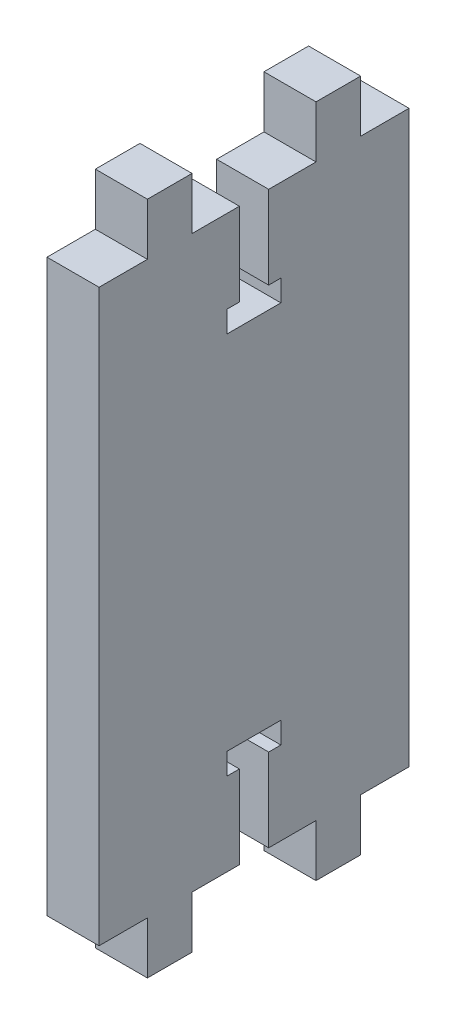
ISO-10303-21;
HEADER;
FILE_DESCRIPTION(('STEP AP214'),'2;1');
FILE_NAME('part.step','',(''),(''),'','','');
FILE_SCHEMA(('AUTOMOTIVE_DESIGN { 1 0 10303 214 1 1 1 1 }'));
ENDSEC;
DATA;
#1=APPLICATION_CONTEXT('core data for automotive mechanical design processes');
#2=APPLICATION_PROTOCOL_DEFINITION('international standard','automotive_design',2000,#1);
#3=PRODUCT_CONTEXT('',#1,'mechanical');
#4=PRODUCT('Part','Part','',(#3));
#5=PRODUCT_RELATED_PRODUCT_CATEGORY('part','',(#4));
#6=PRODUCT_DEFINITION_FORMATION('','',#4);
#7=PRODUCT_DEFINITION_CONTEXT('part definition',#1,'design');
#8=PRODUCT_DEFINITION('design','',#6,#7);
#9=PRODUCT_DEFINITION_SHAPE('','',#8);
#10=(LENGTH_UNIT() NAMED_UNIT(*) SI_UNIT(.MILLI.,.METRE.));
#11=(NAMED_UNIT(*) PLANE_ANGLE_UNIT() SI_UNIT($,.RADIAN.));
#12=(NAMED_UNIT(*) SI_UNIT($,.STERADIAN.) SOLID_ANGLE_UNIT());
#13=UNCERTAINTY_MEASURE_WITH_UNIT(LENGTH_MEASURE(1.E-05),#10,'distance_accuracy_value','');
#14=(GEOMETRIC_REPRESENTATION_CONTEXT(3) GLOBAL_UNCERTAINTY_ASSIGNED_CONTEXT((#13)) GLOBAL_UNIT_ASSIGNED_CONTEXT((#10,
#11,#12)) REPRESENTATION_CONTEXT('',''));
#15=CARTESIAN_POINT('',(0.,0.,0.));
#16=DIRECTION('',(0.,0.,1.));
#17=DIRECTION('',(1.,0.,0.));
#18=AXIS2_PLACEMENT_3D('',#15,#16,#17);
#19=CARTESIAN_POINT('',(5.334,-29.21,0.));
#20=DIRECTION('',(0.,1.,0.));
#21=DIRECTION('',(0.,0.,1.));
#22=AXIS2_PLACEMENT_3D('',#19,#20,#21);
#23=PLANE('',#22);
#24=DIRECTION('',(-1.,0.,0.));
#25=VECTOR('',#24,1.);
#26=CARTESIAN_POINT('',(5.334,-29.21,-6.34999999999999));
#27=LINE('',#26,#25);
#28=CARTESIAN_POINT('',(5.334,-29.21,-6.34999999999999));
#29=VERTEX_POINT('',#28);
#30=CARTESIAN_POINT('',(0.,-29.21,-6.34999999999999));
#31=VERTEX_POINT('',#30);
#32=EDGE_CURVE('E237',#29,#31,#27,.T.);
#33=ORIENTED_EDGE('',*,*,#32,.F.);
#34=DIRECTION('',(0.,0.,-1.));
#35=VECTOR('',#34,1.);
#36=CARTESIAN_POINT('',(5.334,-29.21,0.));
#37=LINE('',#36,#35);
#38=CARTESIAN_POINT('',(5.334,-29.21,-1.5));
#39=VERTEX_POINT('',#38);
#40=EDGE_CURVE('E584',#39,#29,#37,.T.);
#41=ORIENTED_EDGE('',*,*,#40,.F.);
#42=DIRECTION('',(-1.,0.,0.));
#43=VECTOR('',#42,1.);
#44=CARTESIAN_POINT('',(5.334,-29.21,-1.5));
#45=LINE('',#44,#43);
#46=CARTESIAN_POINT('',(0.,-29.21,-1.5));
#47=VERTEX_POINT('',#46);
#48=EDGE_CURVE('E337',#39,#47,#45,.T.);
#49=ORIENTED_EDGE('',*,*,#48,.T.);
#50=DIRECTION('',(0.,0.,-1.));
#51=VECTOR('',#50,1.);
#52=CARTESIAN_POINT('',(0.,-29.21,0.));
#53=LINE('',#52,#51);
#54=EDGE_CURVE('E502',#47,#31,#53,.T.);
#55=ORIENTED_EDGE('',*,*,#54,.T.);
#56=EDGE_LOOP('',(#33,#41,#49,#55));
#57=FACE_BOUND('',#56,.T.);
#58=ADVANCED_FACE('F227',(#57),#23,.F.);
#59=CARTESIAN_POINT('',(5.334,-29.21,-10.922));
#60=VERTEX_POINT('',#59);
#61=CARTESIAN_POINT('',(5.334,-29.21,-15.875));
#62=VERTEX_POINT('',#61);
#63=EDGE_CURVE('E587',#60,#62,#37,.T.);
#64=ORIENTED_EDGE('',*,*,#63,.F.);
#65=DIRECTION('',(-1.,0.,0.));
#66=VECTOR('',#65,1.);
#67=CARTESIAN_POINT('',(5.334,-29.21,-10.922));
#68=LINE('',#67,#66);
#69=CARTESIAN_POINT('',(0.,-29.21,-10.922));
#70=VERTEX_POINT('',#69);
#71=EDGE_CURVE('E12',#60,#70,#68,.T.);
#72=ORIENTED_EDGE('',*,*,#71,.T.);
#73=CARTESIAN_POINT('',(0.,-29.21,-15.875));
#74=VERTEX_POINT('',#73);
#75=EDGE_CURVE('E504',#70,#74,#53,.T.);
#76=ORIENTED_EDGE('',*,*,#75,.T.);
#77=DIRECTION('',(-1.,0.,0.));
#78=VECTOR('',#77,1.);
#79=CARTESIAN_POINT('',(5.334,-29.21,-15.875));
#80=LINE('',#79,#78);
#81=EDGE_CURVE('E340',#62,#74,#80,.T.);
#82=ORIENTED_EDGE('',*,*,#81,.F.);
#83=EDGE_LOOP('',(#64,#72,#76,#82));
#84=FACE_BOUND('',#83,.T.);
#85=ADVANCED_FACE('F609',(#84),#23,.F.);
#86=CARTESIAN_POINT('',(5.334,0.,-15.875));
#87=DIRECTION('',(0.,0.,1.));
#88=DIRECTION('',(1.,0.,0.));
#89=AXIS2_PLACEMENT_3D('',#86,#87,#88);
#90=PLANE('',#89);
#91=DIRECTION('',(0.,1.,0.));
#92=VECTOR('',#91,1.);
#93=CARTESIAN_POINT('',(0.,0.,-15.875));
#94=LINE('',#93,#92);
#95=CARTESIAN_POINT('',(0.,29.21,-15.875));
#96=VERTEX_POINT('',#95);
#97=EDGE_CURVE('E499',#74,#96,#94,.T.);
#98=ORIENTED_EDGE('',*,*,#97,.T.);
#99=DIRECTION('',(-1.,0.,0.));
#100=VECTOR('',#99,1.);
#101=CARTESIAN_POINT('',(5.334,29.21,-15.875));
#102=LINE('',#101,#100);
#103=CARTESIAN_POINT('',(5.334,29.21,-15.875));
#104=VERTEX_POINT('',#103);
#105=EDGE_CURVE('E343',#104,#96,#102,.T.);
#106=ORIENTED_EDGE('',*,*,#105,.F.);
#107=DIRECTION('',(0.,1.,0.));
#108=VECTOR('',#107,1.);
#109=CARTESIAN_POINT('',(5.334,0.,-15.875));
#110=LINE('',#109,#108);
#111=EDGE_CURVE('E581',#62,#104,#110,.T.);
#112=ORIENTED_EDGE('',*,*,#111,.F.);
#113=ORIENTED_EDGE('',*,*,#81,.T.);
#114=EDGE_LOOP('',(#98,#106,#112,#113));
#115=FACE_BOUND('',#114,.T.);
#116=ADVANCED_FACE('F613',(#115),#90,.F.);
#117=CARTESIAN_POINT('',(5.334,29.21,0.));
#118=DIRECTION('',(0.,1.,0.));
#119=DIRECTION('',(0.,0.,1.));
#120=AXIS2_PLACEMENT_3D('',#117,#118,#119);
#121=PLANE('',#120);
#122=DIRECTION('',(0.,0.,-1.));
#123=VECTOR('',#122,1.);
#124=CARTESIAN_POINT('',(0.,29.21,0.));
#125=LINE('',#124,#123);
#126=CARTESIAN_POINT('',(0.,29.21,-10.922));
#127=VERTEX_POINT('',#126);
#128=EDGE_CURVE('E496',#127,#96,#125,.T.);
#129=ORIENTED_EDGE('',*,*,#128,.F.);
#130=DIRECTION('',(-1.,0.,0.));
#131=VECTOR('',#130,1.);
#132=CARTESIAN_POINT('',(5.334,29.21,-10.922));
#133=LINE('',#132,#131);
#134=CARTESIAN_POINT('',(5.334,29.21,-10.922));
#135=VERTEX_POINT('',#134);
#136=EDGE_CURVE('E346',#135,#127,#133,.T.);
#137=ORIENTED_EDGE('',*,*,#136,.F.);
#138=DIRECTION('',(0.,0.,-1.));
#139=VECTOR('',#138,1.);
#140=CARTESIAN_POINT('',(5.334,29.21,0.));
#141=LINE('',#140,#139);
#142=EDGE_CURVE('E578',#135,#104,#141,.T.);
#143=ORIENTED_EDGE('',*,*,#142,.T.);
#144=ORIENTED_EDGE('',*,*,#105,.T.);
#145=EDGE_LOOP('',(#129,#137,#143,#144));
#146=FACE_BOUND('',#145,.T.);
#147=ADVANCED_FACE('F620',(#146),#121,.T.);
#148=CARTESIAN_POINT('',(5.334,0.,-10.922));
#149=DIRECTION('',(0.,0.,1.));
#150=DIRECTION('',(0.,-1.,0.));
#151=AXIS2_PLACEMENT_3D('',#148,#149,#150);
#152=PLANE('',#151);
#153=DIRECTION('',(0.,1.,0.));
#154=VECTOR('',#153,1.);
#155=CARTESIAN_POINT('',(0.,0.,-10.922));
#156=LINE('',#155,#154);
#157=CARTESIAN_POINT('',(0.,34.544,-10.922));
#158=VERTEX_POINT('',#157);
#159=EDGE_CURVE('E493',#127,#158,#156,.T.);
#160=ORIENTED_EDGE('',*,*,#159,.T.);
#161=DIRECTION('',(-1.,0.,0.));
#162=VECTOR('',#161,1.);
#163=CARTESIAN_POINT('',(5.334,34.544,-10.922));
#164=LINE('',#163,#162);
#165=CARTESIAN_POINT('',(5.334,34.544,-10.922));
#166=VERTEX_POINT('',#165);
#167=EDGE_CURVE('E349',#166,#158,#164,.T.);
#168=ORIENTED_EDGE('',*,*,#167,.F.);
#169=DIRECTION('',(0.,1.,0.));
#170=VECTOR('',#169,1.);
#171=CARTESIAN_POINT('',(5.334,0.,-10.922));
#172=LINE('',#171,#170);
#173=EDGE_CURVE('E575',#135,#166,#172,.T.);
#174=ORIENTED_EDGE('',*,*,#173,.F.);
#175=ORIENTED_EDGE('',*,*,#136,.T.);
#176=EDGE_LOOP('',(#160,#168,#174,#175));
#177=FACE_BOUND('',#176,.T.);
#178=ADVANCED_FACE('F755',(#177),#152,.F.);
#179=CARTESIAN_POINT('',(5.334,34.544,0.));
#180=DIRECTION('',(0.,1.,0.));
#181=DIRECTION('',(0.,0.,1.));
#182=AXIS2_PLACEMENT_3D('',#179,#180,#181);
#183=PLANE('',#182);
#184=DIRECTION('',(0.,0.,-1.));
#185=VECTOR('',#184,1.);
#186=CARTESIAN_POINT('',(0.,34.544,0.));
#187=LINE('',#186,#185);
#188=CARTESIAN_POINT('',(0.,34.544,-6.34999999999999));
#189=VERTEX_POINT('',#188);
#190=EDGE_CURVE('E490',#189,#158,#187,.T.);
#191=ORIENTED_EDGE('',*,*,#190,.F.);
#192=DIRECTION('',(-1.,0.,0.));
#193=VECTOR('',#192,1.);
#194=CARTESIAN_POINT('',(5.334,34.544,-6.34999999999999));
#195=LINE('',#194,#193);
#196=CARTESIAN_POINT('',(5.334,34.544,-6.34999999999999));
#197=VERTEX_POINT('',#196);
#198=EDGE_CURVE('E352',#197,#189,#195,.T.);
#199=ORIENTED_EDGE('',*,*,#198,.F.);
#200=DIRECTION('',(0.,0.,-1.));
#201=VECTOR('',#200,1.);
#202=CARTESIAN_POINT('',(5.334,34.544,0.));
#203=LINE('',#202,#201);
#204=EDGE_CURVE('E572',#197,#166,#203,.T.);
#205=ORIENTED_EDGE('',*,*,#204,.T.);
#206=ORIENTED_EDGE('',*,*,#167,.T.);
#207=EDGE_LOOP('',(#191,#199,#205,#206));
#208=FACE_BOUND('',#207,.T.);
#209=ADVANCED_FACE('F757',(#208),#183,.T.);
#210=CARTESIAN_POINT('',(5.334,0.,-6.34999999999999));
#211=DIRECTION('',(0.,0.,1.));
#212=DIRECTION('',(0.,-1.,0.));
#213=AXIS2_PLACEMENT_3D('',#210,#211,#212);
#214=PLANE('',#213);
#215=DIRECTION('',(0.,1.,0.));
#216=VECTOR('',#215,1.);
#217=CARTESIAN_POINT('',(0.,0.,-6.34999999999999));
#218=LINE('',#217,#216);
#219=CARTESIAN_POINT('',(0.,29.21,-6.34999999999999));
#220=VERTEX_POINT('',#219);
#221=EDGE_CURVE('E487',#220,#189,#218,.T.);
#222=ORIENTED_EDGE('',*,*,#221,.F.);
#223=DIRECTION('',(-1.,0.,0.));
#224=VECTOR('',#223,1.);
#225=CARTESIAN_POINT('',(5.334,29.21,-6.34999999999999));
#226=LINE('',#225,#224);
#227=CARTESIAN_POINT('',(5.334,29.21,-6.34999999999999));
#228=VERTEX_POINT('',#227);
#229=EDGE_CURVE('E355',#228,#220,#226,.T.);
#230=ORIENTED_EDGE('',*,*,#229,.F.);
#231=DIRECTION('',(0.,1.,0.));
#232=VECTOR('',#231,1.);
#233=CARTESIAN_POINT('',(5.334,0.,-6.34999999999999));
#234=LINE('',#233,#232);
#235=EDGE_CURVE('E569',#228,#197,#234,.T.);
#236=ORIENTED_EDGE('',*,*,#235,.T.);
#237=ORIENTED_EDGE('',*,*,#198,.T.);
#238=EDGE_LOOP('',(#222,#230,#236,#237));
#239=FACE_BOUND('',#238,.T.);
#240=ADVANCED_FACE('F762',(#239),#214,.T.);
#241=CARTESIAN_POINT('',(5.334,29.21,0.));
#242=DIRECTION('',(0.,1.,0.));
#243=DIRECTION('',(0.,0.,1.));
#244=AXIS2_PLACEMENT_3D('',#241,#242,#243);
#245=PLANE('',#244);
#246=DIRECTION('',(0.,0.,-1.));
#247=VECTOR('',#246,1.);
#248=CARTESIAN_POINT('',(0.,29.21,0.));
#249=LINE('',#248,#247);
#250=CARTESIAN_POINT('',(0.,29.21,-1.5));
#251=VERTEX_POINT('',#250);
#252=EDGE_CURVE('E484',#251,#220,#249,.T.);
#253=ORIENTED_EDGE('',*,*,#252,.F.);
#254=DIRECTION('',(-1.,0.,0.));
#255=VECTOR('',#254,1.);
#256=CARTESIAN_POINT('',(5.334,29.21,-1.5));
#257=LINE('',#256,#255);
#258=CARTESIAN_POINT('',(5.334,29.21,-1.5));
#259=VERTEX_POINT('',#258);
#260=EDGE_CURVE('E358',#259,#251,#257,.T.);
#261=ORIENTED_EDGE('',*,*,#260,.F.);
#262=DIRECTION('',(0.,0.,-1.));
#263=VECTOR('',#262,1.);
#264=CARTESIAN_POINT('',(5.334,29.21,0.));
#265=LINE('',#264,#263);
#266=EDGE_CURVE('E566',#259,#228,#265,.T.);
#267=ORIENTED_EDGE('',*,*,#266,.T.);
#268=ORIENTED_EDGE('',*,*,#229,.T.);
#269=EDGE_LOOP('',(#253,#261,#267,#268));
#270=FACE_BOUND('',#269,.T.);
#271=ADVANCED_FACE('F765',(#270),#245,.T.);
#272=CARTESIAN_POINT('',(5.334,0.,-1.5));
#273=DIRECTION('',(0.,0.,-1.));
#274=DIRECTION('',(0.,1.,0.));
#275=AXIS2_PLACEMENT_3D('',#272,#273,#274);
#276=PLANE('',#275);
#277=DIRECTION('',(0.,-1.,0.));
#278=VECTOR('',#277,1.);
#279=CARTESIAN_POINT('',(0.,0.,-1.5));
#280=LINE('',#279,#278);
#281=CARTESIAN_POINT('',(0.,20.71,-1.5));
#282=VERTEX_POINT('',#281);
#283=EDGE_CURVE('E481',#251,#282,#280,.T.);
#284=ORIENTED_EDGE('',*,*,#283,.T.);
#285=DIRECTION('',(-1.,0.,0.));
#286=VECTOR('',#285,1.);
#287=CARTESIAN_POINT('',(5.334,20.71,-1.5));
#288=LINE('',#287,#286);
#289=CARTESIAN_POINT('',(5.334,20.71,-1.5));
#290=VERTEX_POINT('',#289);
#291=EDGE_CURVE('E361',#290,#282,#288,.T.);
#292=ORIENTED_EDGE('',*,*,#291,.F.);
#293=DIRECTION('',(0.,-1.,0.));
#294=VECTOR('',#293,1.);
#295=CARTESIAN_POINT('',(5.334,0.,-1.5));
#296=LINE('',#295,#294);
#297=EDGE_CURVE('E563',#259,#290,#296,.T.);
#298=ORIENTED_EDGE('',*,*,#297,.F.);
#299=ORIENTED_EDGE('',*,*,#260,.T.);
#300=EDGE_LOOP('',(#284,#292,#298,#299));
#301=FACE_BOUND('',#300,.T.);
#302=ADVANCED_FACE('F771',(#301),#276,.F.);
#303=CARTESIAN_POINT('',(5.334,20.71,1.14963594199935E-13));
#304=DIRECTION('',(0.,1.,0.));
#305=DIRECTION('',(0.,0.,1.));
#306=AXIS2_PLACEMENT_3D('',#303,#304,#305);
#307=PLANE('',#306);
#308=DIRECTION('',(0.,0.,-1.));
#309=VECTOR('',#308,1.);
#310=CARTESIAN_POINT('',(0.,20.71,1.14963594199935E-13));
#311=LINE('',#310,#309);
#312=CARTESIAN_POINT('',(0.,20.71,-2.75));
#313=VERTEX_POINT('',#312);
#314=EDGE_CURVE('E478',#282,#313,#311,.T.);
#315=ORIENTED_EDGE('',*,*,#314,.T.);
#316=DIRECTION('',(-1.,0.,0.));
#317=VECTOR('',#316,1.);
#318=CARTESIAN_POINT('',(5.334,20.71,-2.75));
#319=LINE('',#318,#317);
#320=CARTESIAN_POINT('',(5.334,20.71,-2.75));
#321=VERTEX_POINT('',#320);
#322=EDGE_CURVE('E364',#321,#313,#319,.T.);
#323=ORIENTED_EDGE('',*,*,#322,.F.);
#324=DIRECTION('',(0.,0.,-1.));
#325=VECTOR('',#324,1.);
#326=CARTESIAN_POINT('',(5.334,20.71,1.14963594199935E-13));
#327=LINE('',#326,#325);
#328=EDGE_CURVE('E560',#290,#321,#327,.T.);
#329=ORIENTED_EDGE('',*,*,#328,.F.);
#330=ORIENTED_EDGE('',*,*,#291,.T.);
#331=EDGE_LOOP('',(#315,#323,#329,#330));
#332=FACE_BOUND('',#331,.T.);
#333=ADVANCED_FACE('F775',(#332),#307,.F.);
#334=CARTESIAN_POINT('',(5.334,0.,-2.75));
#335=DIRECTION('',(0.,0.,-1.));
#336=DIRECTION('',(0.,1.,0.));
#337=AXIS2_PLACEMENT_3D('',#334,#335,#336);
#338=PLANE('',#337);
#339=DIRECTION('',(0.,-1.,0.));
#340=VECTOR('',#339,1.);
#341=CARTESIAN_POINT('',(0.,0.,-2.75));
#342=LINE('',#341,#340);
#343=CARTESIAN_POINT('',(0.,18.51,-2.75));
#344=VERTEX_POINT('',#343);
#345=EDGE_CURVE('E475',#313,#344,#342,.T.);
#346=ORIENTED_EDGE('',*,*,#345,.T.);
#347=DIRECTION('',(-1.,0.,0.));
#348=VECTOR('',#347,1.);
#349=CARTESIAN_POINT('',(5.334,18.51,-2.75));
#350=LINE('',#349,#348);
#351=CARTESIAN_POINT('',(5.334,18.51,-2.75));
#352=VERTEX_POINT('',#351);
#353=EDGE_CURVE('E367',#352,#344,#350,.T.);
#354=ORIENTED_EDGE('',*,*,#353,.F.);
#355=DIRECTION('',(0.,-1.,0.));
#356=VECTOR('',#355,1.);
#357=CARTESIAN_POINT('',(5.334,0.,-2.75));
#358=LINE('',#357,#356);
#359=EDGE_CURVE('E557',#321,#352,#358,.T.);
#360=ORIENTED_EDGE('',*,*,#359,.F.);
#361=ORIENTED_EDGE('',*,*,#322,.T.);
#362=EDGE_LOOP('',(#346,#354,#360,#361));
#363=FACE_BOUND('',#362,.T.);
#364=ADVANCED_FACE('F780',(#363),#338,.F.);
#365=CARTESIAN_POINT('',(5.334,18.51,0.));
#366=DIRECTION('',(0.,1.,0.));
#367=DIRECTION('',(0.,0.,1.));
#368=AXIS2_PLACEMENT_3D('',#365,#366,#367);
#369=PLANE('',#368);
#370=DIRECTION('',(0.,0.,-1.));
#371=VECTOR('',#370,1.);
#372=CARTESIAN_POINT('',(0.,18.51,0.));
#373=LINE('',#372,#371);
#374=CARTESIAN_POINT('',(0.,18.51,2.75));
#375=VERTEX_POINT('',#374);
#376=EDGE_CURVE('E472',#375,#344,#373,.T.);
#377=ORIENTED_EDGE('',*,*,#376,.F.);
#378=DIRECTION('',(-1.,0.,0.));
#379=VECTOR('',#378,1.);
#380=CARTESIAN_POINT('',(5.334,18.51,2.75));
#381=LINE('',#380,#379);
#382=CARTESIAN_POINT('',(5.334,18.51,2.75));
#383=VERTEX_POINT('',#382);
#384=EDGE_CURVE('E370',#383,#375,#381,.T.);
#385=ORIENTED_EDGE('',*,*,#384,.F.);
#386=DIRECTION('',(0.,0.,-1.));
#387=VECTOR('',#386,1.);
#388=CARTESIAN_POINT('',(5.334,18.51,0.));
#389=LINE('',#388,#387);
#390=EDGE_CURVE('E554',#383,#352,#389,.T.);
#391=ORIENTED_EDGE('',*,*,#390,.T.);
#392=ORIENTED_EDGE('',*,*,#353,.T.);
#393=EDGE_LOOP('',(#377,#385,#391,#392));
#394=FACE_BOUND('',#393,.T.);
#395=ADVANCED_FACE('F936',(#394),#369,.T.);
#396=CARTESIAN_POINT('',(5.334,0.,2.75));
#397=DIRECTION('',(0.,0.,-1.));
#398=DIRECTION('',(0.,1.,0.));
#399=AXIS2_PLACEMENT_3D('',#396,#397,#398);
#400=PLANE('',#399);
#401=DIRECTION('',(0.,-1.,0.));
#402=VECTOR('',#401,1.);
#403=CARTESIAN_POINT('',(0.,0.,2.75));
#404=LINE('',#403,#402);
#405=CARTESIAN_POINT('',(0.,20.71,2.75));
#406=VERTEX_POINT('',#405);
#407=EDGE_CURVE('E469',#406,#375,#404,.T.);
#408=ORIENTED_EDGE('',*,*,#407,.F.);
#409=DIRECTION('',(-1.,0.,0.));
#410=VECTOR('',#409,1.);
#411=CARTESIAN_POINT('',(5.334,20.71,2.75));
#412=LINE('',#411,#410);
#413=CARTESIAN_POINT('',(5.334,20.71,2.75));
#414=VERTEX_POINT('',#413);
#415=EDGE_CURVE('E373',#414,#406,#412,.T.);
#416=ORIENTED_EDGE('',*,*,#415,.F.);
#417=DIRECTION('',(0.,-1.,0.));
#418=VECTOR('',#417,1.);
#419=CARTESIAN_POINT('',(5.334,0.,2.75));
#420=LINE('',#419,#418);
#421=EDGE_CURVE('E551',#414,#383,#420,.T.);
#422=ORIENTED_EDGE('',*,*,#421,.T.);
#423=ORIENTED_EDGE('',*,*,#384,.T.);
#424=EDGE_LOOP('',(#408,#416,#422,#423));
#425=FACE_BOUND('',#424,.T.);
#426=ADVANCED_FACE('F786',(#425),#400,.T.);
#427=CARTESIAN_POINT('',(5.334,20.71,0.));
#428=DIRECTION('',(0.,1.,0.));
#429=DIRECTION('',(0.,0.,1.));
#430=AXIS2_PLACEMENT_3D('',#427,#428,#429);
#431=PLANE('',#430);
#432=DIRECTION('',(0.,0.,-1.));
#433=VECTOR('',#432,1.);
#434=CARTESIAN_POINT('',(0.,20.71,0.));
#435=LINE('',#434,#433);
#436=CARTESIAN_POINT('',(0.,20.71,1.5));
#437=VERTEX_POINT('',#436);
#438=EDGE_CURVE('E466',#406,#437,#435,.T.);
#439=ORIENTED_EDGE('',*,*,#438,.T.);
#440=DIRECTION('',(-1.,0.,0.));
#441=VECTOR('',#440,1.);
#442=CARTESIAN_POINT('',(5.334,20.71,1.5));
#443=LINE('',#442,#441);
#444=CARTESIAN_POINT('',(5.334,20.71,1.5));
#445=VERTEX_POINT('',#444);
#446=EDGE_CURVE('E376',#445,#437,#443,.T.);
#447=ORIENTED_EDGE('',*,*,#446,.F.);
#448=DIRECTION('',(0.,0.,-1.));
#449=VECTOR('',#448,1.);
#450=CARTESIAN_POINT('',(5.334,20.71,0.));
#451=LINE('',#450,#449);
#452=EDGE_CURVE('E548',#414,#445,#451,.T.);
#453=ORIENTED_EDGE('',*,*,#452,.F.);
#454=ORIENTED_EDGE('',*,*,#415,.T.);
#455=EDGE_LOOP('',(#439,#447,#453,#454));
#456=FACE_BOUND('',#455,.T.);
#457=ADVANCED_FACE('F792',(#456),#431,.F.);
#458=CARTESIAN_POINT('',(5.334,0.,1.5));
#459=DIRECTION('',(0.,0.,-1.));
#460=DIRECTION('',(0.,1.,0.));
#461=AXIS2_PLACEMENT_3D('',#458,#459,#460);
#462=PLANE('',#461);
#463=DIRECTION('',(0.,-1.,0.));
#464=VECTOR('',#463,1.);
#465=CARTESIAN_POINT('',(0.,0.,1.5));
#466=LINE('',#465,#464);
#467=CARTESIAN_POINT('',(0.,29.21,1.5));
#468=VERTEX_POINT('',#467);
#469=EDGE_CURVE('E463',#468,#437,#466,.T.);
#470=ORIENTED_EDGE('',*,*,#469,.F.);
#471=DIRECTION('',(-1.,0.,0.));
#472=VECTOR('',#471,1.);
#473=CARTESIAN_POINT('',(5.334,29.21,1.5));
#474=LINE('',#473,#472);
#475=CARTESIAN_POINT('',(5.334,29.21,1.5));
#476=VERTEX_POINT('',#475);
#477=EDGE_CURVE('E379',#476,#468,#474,.T.);
#478=ORIENTED_EDGE('',*,*,#477,.F.);
#479=DIRECTION('',(0.,-1.,0.));
#480=VECTOR('',#479,1.);
#481=CARTESIAN_POINT('',(5.334,0.,1.5));
#482=LINE('',#481,#480);
#483=EDGE_CURVE('E545',#476,#445,#482,.T.);
#484=ORIENTED_EDGE('',*,*,#483,.T.);
#485=ORIENTED_EDGE('',*,*,#446,.T.);
#486=EDGE_LOOP('',(#470,#478,#484,#485));
#487=FACE_BOUND('',#486,.T.);
#488=ADVANCED_FACE('F929',(#487),#462,.T.);
#489=CARTESIAN_POINT('',(5.334,29.21,0.));
#490=DIRECTION('',(0.,1.,0.));
#491=DIRECTION('',(0.,0.,1.));
#492=AXIS2_PLACEMENT_3D('',#489,#490,#491);
#493=PLANE('',#492);
#494=DIRECTION('',(0.,0.,-1.));
#495=VECTOR('',#494,1.);
#496=CARTESIAN_POINT('',(0.,29.21,0.));
#497=LINE('',#496,#495);
#498=CARTESIAN_POINT('',(0.,29.21,6.35000000000001));
#499=VERTEX_POINT('',#498);
#500=EDGE_CURVE('E460',#499,#468,#497,.T.);
#501=ORIENTED_EDGE('',*,*,#500,.F.);
#502=DIRECTION('',(-1.,0.,0.));
#503=VECTOR('',#502,1.);
#504=CARTESIAN_POINT('',(5.334,29.21,6.35000000000001));
#505=LINE('',#504,#503);
#506=CARTESIAN_POINT('',(5.334,29.21,6.35000000000001));
#507=VERTEX_POINT('',#506);
#508=EDGE_CURVE('E382',#507,#499,#505,.T.);
#509=ORIENTED_EDGE('',*,*,#508,.F.);
#510=DIRECTION('',(0.,0.,-1.));
#511=VECTOR('',#510,1.);
#512=CARTESIAN_POINT('',(5.334,29.21,0.));
#513=LINE('',#512,#511);
#514=EDGE_CURVE('E542',#507,#476,#513,.T.);
#515=ORIENTED_EDGE('',*,*,#514,.T.);
#516=ORIENTED_EDGE('',*,*,#477,.T.);
#517=EDGE_LOOP('',(#501,#509,#515,#516));
#518=FACE_BOUND('',#517,.T.);
#519=ADVANCED_FACE('F798',(#518),#493,.T.);
#520=CARTESIAN_POINT('',(5.334,0.,6.35000000000001));
#521=DIRECTION('',(0.,0.,1.));
#522=DIRECTION('',(1.,0.,0.));
#523=AXIS2_PLACEMENT_3D('',#520,#521,#522);
#524=PLANE('',#523);
#525=DIRECTION('',(0.,1.,0.));
#526=VECTOR('',#525,1.);
#527=CARTESIAN_POINT('',(0.,0.,6.35000000000001));
#528=LINE('',#527,#526);
#529=CARTESIAN_POINT('',(0.,34.544,6.35000000000001));
#530=VERTEX_POINT('',#529);
#531=EDGE_CURVE('E457',#499,#530,#528,.T.);
#532=ORIENTED_EDGE('',*,*,#531,.T.);
#533=DIRECTION('',(-1.,0.,0.));
#534=VECTOR('',#533,1.);
#535=CARTESIAN_POINT('',(5.334,34.544,6.35000000000001));
#536=LINE('',#535,#534);
#537=CARTESIAN_POINT('',(5.334,34.544,6.35000000000001));
#538=VERTEX_POINT('',#537);
#539=EDGE_CURVE('E385',#538,#530,#536,.T.);
#540=ORIENTED_EDGE('',*,*,#539,.F.);
#541=DIRECTION('',(0.,1.,0.));
#542=VECTOR('',#541,1.);
#543=CARTESIAN_POINT('',(5.334,0.,6.35000000000001));
#544=LINE('',#543,#542);
#545=EDGE_CURVE('E539',#507,#538,#544,.T.);
#546=ORIENTED_EDGE('',*,*,#545,.F.);
#547=ORIENTED_EDGE('',*,*,#508,.T.);
#548=EDGE_LOOP('',(#532,#540,#546,#547));
#549=FACE_BOUND('',#548,.T.);
#550=ADVANCED_FACE('F804',(#549),#524,.F.);
#551=CARTESIAN_POINT('',(5.334,34.544,0.));
#552=DIRECTION('',(0.,1.,0.));
#553=DIRECTION('',(0.,0.,1.));
#554=AXIS2_PLACEMENT_3D('',#551,#552,#553);
#555=PLANE('',#554);
#556=DIRECTION('',(0.,0.,-1.));
#557=VECTOR('',#556,1.);
#558=CARTESIAN_POINT('',(0.,34.544,0.));
#559=LINE('',#558,#557);
#560=CARTESIAN_POINT('',(0.,34.544,10.922));
#561=VERTEX_POINT('',#560);
#562=EDGE_CURVE('E454',#561,#530,#559,.T.);
#563=ORIENTED_EDGE('',*,*,#562,.F.);
#564=DIRECTION('',(-1.,0.,0.));
#565=VECTOR('',#564,1.);
#566=CARTESIAN_POINT('',(5.334,34.544,10.922));
#567=LINE('',#566,#565);
#568=CARTESIAN_POINT('',(5.334,34.544,10.922));
#569=VERTEX_POINT('',#568);
#570=EDGE_CURVE('E388',#569,#561,#567,.T.);
#571=ORIENTED_EDGE('',*,*,#570,.F.);
#572=DIRECTION('',(0.,0.,-1.));
#573=VECTOR('',#572,1.);
#574=CARTESIAN_POINT('',(5.334,34.544,0.));
#575=LINE('',#574,#573);
#576=EDGE_CURVE('E536',#569,#538,#575,.T.);
#577=ORIENTED_EDGE('',*,*,#576,.T.);
#578=ORIENTED_EDGE('',*,*,#539,.T.);
#579=EDGE_LOOP('',(#563,#571,#577,#578));
#580=FACE_BOUND('',#579,.T.);
#581=ADVANCED_FACE('F922',(#580),#555,.T.);
#582=CARTESIAN_POINT('',(5.334,0.,10.922));
#583=DIRECTION('',(0.,0.,1.));
#584=DIRECTION('',(1.,0.,0.));
#585=AXIS2_PLACEMENT_3D('',#582,#583,#584);
#586=PLANE('',#585);
#587=DIRECTION('',(0.,1.,0.));
#588=VECTOR('',#587,1.);
#589=CARTESIAN_POINT('',(0.,0.,10.922));
#590=LINE('',#589,#588);
#591=CARTESIAN_POINT('',(0.,29.21,10.922));
#592=VERTEX_POINT('',#591);
#593=EDGE_CURVE('E451',#592,#561,#590,.T.);
#594=ORIENTED_EDGE('',*,*,#593,.F.);
#595=DIRECTION('',(-1.,0.,0.));
#596=VECTOR('',#595,1.);
#597=CARTESIAN_POINT('',(5.334,29.21,10.922));
#598=LINE('',#597,#596);
#599=CARTESIAN_POINT('',(5.334,29.21,10.922));
#600=VERTEX_POINT('',#599);
#601=EDGE_CURVE('E391',#600,#592,#598,.T.);
#602=ORIENTED_EDGE('',*,*,#601,.F.);
#603=DIRECTION('',(0.,1.,0.));
#604=VECTOR('',#603,1.);
#605=CARTESIAN_POINT('',(5.334,0.,10.922));
#606=LINE('',#605,#604);
#607=EDGE_CURVE('E533',#600,#569,#606,.T.);
#608=ORIENTED_EDGE('',*,*,#607,.T.);
#609=ORIENTED_EDGE('',*,*,#570,.T.);
#610=EDGE_LOOP('',(#594,#602,#608,#609));
#611=FACE_BOUND('',#610,.T.);
#612=ADVANCED_FACE('F811',(#611),#586,.T.);
#613=CARTESIAN_POINT('',(5.334,29.21,0.));
#614=DIRECTION('',(0.,1.,0.));
#615=DIRECTION('',(0.,0.,1.));
#616=AXIS2_PLACEMENT_3D('',#613,#614,#615);
#617=PLANE('',#616);
#618=DIRECTION('',(0.,0.,-1.));
#619=VECTOR('',#618,1.);
#620=CARTESIAN_POINT('',(0.,29.21,0.));
#621=LINE('',#620,#619);
#622=CARTESIAN_POINT('',(0.,29.21,15.875));
#623=VERTEX_POINT('',#622);
#624=EDGE_CURVE('E448',#623,#592,#621,.T.);
#625=ORIENTED_EDGE('',*,*,#624,.F.);
#626=DIRECTION('',(-1.,0.,0.));
#627=VECTOR('',#626,1.);
#628=CARTESIAN_POINT('',(5.334,29.21,15.875));
#629=LINE('',#628,#627);
#630=CARTESIAN_POINT('',(5.334,29.21,15.875));
#631=VERTEX_POINT('',#630);
#632=EDGE_CURVE('E394',#631,#623,#629,.T.);
#633=ORIENTED_EDGE('',*,*,#632,.F.);
#634=DIRECTION('',(0.,0.,-1.));
#635=VECTOR('',#634,1.);
#636=CARTESIAN_POINT('',(5.334,29.21,0.));
#637=LINE('',#636,#635);
#638=EDGE_CURVE('E530',#631,#600,#637,.T.);
#639=ORIENTED_EDGE('',*,*,#638,.T.);
#640=ORIENTED_EDGE('',*,*,#601,.T.);
#641=EDGE_LOOP('',(#625,#633,#639,#640));
#642=FACE_BOUND('',#641,.T.);
#643=ADVANCED_FACE('F815',(#642),#617,.T.);
#644=CARTESIAN_POINT('',(5.334,0.,15.875));
#645=DIRECTION('',(0.,0.,1.));
#646=DIRECTION('',(1.,0.,0.));
#647=AXIS2_PLACEMENT_3D('',#644,#645,#646);
#648=PLANE('',#647);
#649=DIRECTION('',(0.,1.,0.));
#650=VECTOR('',#649,1.);
#651=CARTESIAN_POINT('',(0.,0.,15.875));
#652=LINE('',#651,#650);
#653=CARTESIAN_POINT('',(0.,-29.21,15.875));
#654=VERTEX_POINT('',#653);
#655=EDGE_CURVE('E445',#654,#623,#652,.T.);
#656=ORIENTED_EDGE('',*,*,#655,.F.);
#657=DIRECTION('',(-1.,0.,0.));
#658=VECTOR('',#657,1.);
#659=CARTESIAN_POINT('',(5.334,-29.21,15.875));
#660=LINE('',#659,#658);
#661=CARTESIAN_POINT('',(5.334,-29.21,15.875));
#662=VERTEX_POINT('',#661);
#663=EDGE_CURVE('E397',#662,#654,#660,.T.);
#664=ORIENTED_EDGE('',*,*,#663,.F.);
#665=DIRECTION('',(0.,1.,0.));
#666=VECTOR('',#665,1.);
#667=CARTESIAN_POINT('',(5.334,0.,15.875));
#668=LINE('',#667,#666);
#669=EDGE_CURVE('E527',#662,#631,#668,.T.);
#670=ORIENTED_EDGE('',*,*,#669,.T.);
#671=ORIENTED_EDGE('',*,*,#632,.T.);
#672=EDGE_LOOP('',(#656,#664,#670,#671));
#673=FACE_BOUND('',#672,.T.);
#674=ADVANCED_FACE('F819',(#673),#648,.T.);
#675=CARTESIAN_POINT('',(5.334,-29.21,0.));
#676=DIRECTION('',(0.,1.,0.));
#677=DIRECTION('',(0.,0.,1.));
#678=AXIS2_PLACEMENT_3D('',#675,#676,#677);
#679=PLANE('',#678);
#680=DIRECTION('',(-1.,0.,0.));
#681=VECTOR('',#680,1.);
#682=CARTESIAN_POINT('',(5.334,-29.21,10.922));
#683=LINE('',#682,#681);
#684=CARTESIAN_POINT('',(5.334,-29.21,10.922));
#685=VERTEX_POINT('',#684);
#686=CARTESIAN_POINT('',(0.,-29.21,10.922));
#687=VERTEX_POINT('',#686);
#688=EDGE_CURVE('E317',#685,#687,#683,.T.);
#689=ORIENTED_EDGE('',*,*,#688,.F.);
#690=DIRECTION('',(0.,0.,-1.));
#691=VECTOR('',#690,1.);
#692=CARTESIAN_POINT('',(5.334,-29.21,0.));
#693=LINE('',#692,#691);
#694=EDGE_CURVE('E523',#662,#685,#693,.T.);
#695=ORIENTED_EDGE('',*,*,#694,.F.);
#696=ORIENTED_EDGE('',*,*,#663,.T.);
#697=DIRECTION('',(0.,0.,-1.));
#698=VECTOR('',#697,1.);
#699=CARTESIAN_POINT('',(0.,-29.21,0.));
#700=LINE('',#699,#698);
#701=EDGE_CURVE('E441',#654,#687,#700,.T.);
#702=ORIENTED_EDGE('',*,*,#701,.T.);
#703=EDGE_LOOP('',(#689,#695,#696,#702));
#704=FACE_BOUND('',#703,.T.);
#705=ADVANCED_FACE('F823',(#704),#679,.F.);
#706=CARTESIAN_POINT('',(5.334,-29.21,6.35000000000001));
#707=VERTEX_POINT('',#706);
#708=CARTESIAN_POINT('',(5.334,-29.21,1.5));
#709=VERTEX_POINT('',#708);
#710=EDGE_CURVE('E526',#707,#709,#693,.T.);
#711=ORIENTED_EDGE('',*,*,#710,.F.);
#712=DIRECTION('',(-1.,0.,0.));
#713=VECTOR('',#712,1.);
#714=CARTESIAN_POINT('',(5.334,-29.21,6.35000000000001));
#715=LINE('',#714,#713);
#716=CARTESIAN_POINT('',(0.,-29.21,6.35000000000001));
#717=VERTEX_POINT('',#716);
#718=EDGE_CURVE('E245',#707,#717,#715,.T.);
#719=ORIENTED_EDGE('',*,*,#718,.T.);
#720=CARTESIAN_POINT('',(0.,-29.21,1.5));
#721=VERTEX_POINT('',#720);
#722=EDGE_CURVE('E444',#717,#721,#700,.T.);
#723=ORIENTED_EDGE('',*,*,#722,.T.);
#724=DIRECTION('',(-1.,0.,0.));
#725=VECTOR('',#724,1.);
#726=CARTESIAN_POINT('',(5.334,-29.21,1.5));
#727=LINE('',#726,#725);
#728=EDGE_CURVE('E400',#709,#721,#727,.T.);
#729=ORIENTED_EDGE('',*,*,#728,.F.);
#730=EDGE_LOOP('',(#711,#719,#723,#729));
#731=FACE_BOUND('',#730,.T.);
#732=ADVANCED_FACE('F838',(#731),#679,.F.);
#733=CARTESIAN_POINT('',(5.334,0.,1.5));
#734=DIRECTION('',(0.,0.,1.));
#735=DIRECTION('',(0.,-1.,0.));
#736=AXIS2_PLACEMENT_3D('',#733,#734,#735);
#737=PLANE('',#736);
#738=DIRECTION('',(0.,1.,0.));
#739=VECTOR('',#738,1.);
#740=CARTESIAN_POINT('',(0.,0.,1.5));
#741=LINE('',#740,#739);
#742=CARTESIAN_POINT('',(0.,-20.71,1.5));
#743=VERTEX_POINT('',#742);
#744=EDGE_CURVE('E438',#721,#743,#741,.T.);
#745=ORIENTED_EDGE('',*,*,#744,.T.);
#746=DIRECTION('',(-1.,0.,0.));
#747=VECTOR('',#746,1.);
#748=CARTESIAN_POINT('',(5.334,-20.71,1.5));
#749=LINE('',#748,#747);
#750=CARTESIAN_POINT('',(5.334,-20.71,1.5));
#751=VERTEX_POINT('',#750);
#752=EDGE_CURVE('E403',#751,#743,#749,.T.);
#753=ORIENTED_EDGE('',*,*,#752,.F.);
#754=DIRECTION('',(0.,1.,0.));
#755=VECTOR('',#754,1.);
#756=CARTESIAN_POINT('',(5.334,0.,1.5));
#757=LINE('',#756,#755);
#758=EDGE_CURVE('E520',#709,#751,#757,.T.);
#759=ORIENTED_EDGE('',*,*,#758,.F.);
#760=ORIENTED_EDGE('',*,*,#728,.T.);
#761=EDGE_LOOP('',(#745,#753,#759,#760));
#762=FACE_BOUND('',#761,.T.);
#763=ADVANCED_FACE('F844',(#762),#737,.F.);
#764=CARTESIAN_POINT('',(5.334,-20.71,0.));
#765=DIRECTION('',(0.,1.,0.));
#766=DIRECTION('',(0.,0.,1.));
#767=AXIS2_PLACEMENT_3D('',#764,#765,#766);
#768=PLANE('',#767);
#769=DIRECTION('',(0.,0.,-1.));
#770=VECTOR('',#769,1.);
#771=CARTESIAN_POINT('',(0.,-20.71,0.));
#772=LINE('',#771,#770);
#773=CARTESIAN_POINT('',(0.,-20.71,2.75));
#774=VERTEX_POINT('',#773);
#775=EDGE_CURVE('E435',#774,#743,#772,.T.);
#776=ORIENTED_EDGE('',*,*,#775,.F.);
#777=DIRECTION('',(-1.,0.,0.));
#778=VECTOR('',#777,1.);
#779=CARTESIAN_POINT('',(5.334,-20.71,2.75));
#780=LINE('',#779,#778);
#781=CARTESIAN_POINT('',(5.334,-20.71,2.75));
#782=VERTEX_POINT('',#781);
#783=EDGE_CURVE('E406',#782,#774,#780,.T.);
#784=ORIENTED_EDGE('',*,*,#783,.F.);
#785=DIRECTION('',(0.,0.,-1.));
#786=VECTOR('',#785,1.);
#787=CARTESIAN_POINT('',(5.334,-20.71,0.));
#788=LINE('',#787,#786);
#789=EDGE_CURVE('E517',#782,#751,#788,.T.);
#790=ORIENTED_EDGE('',*,*,#789,.T.);
#791=ORIENTED_EDGE('',*,*,#752,.T.);
#792=EDGE_LOOP('',(#776,#784,#790,#791));
#793=FACE_BOUND('',#792,.T.);
#794=ADVANCED_FACE('F850',(#793),#768,.T.);
#795=CARTESIAN_POINT('',(5.334,0.,2.75));
#796=DIRECTION('',(0.,0.,1.));
#797=DIRECTION('',(0.,-1.,0.));
#798=AXIS2_PLACEMENT_3D('',#795,#796,#797);
#799=PLANE('',#798);
#800=DIRECTION('',(0.,1.,0.));
#801=VECTOR('',#800,1.);
#802=CARTESIAN_POINT('',(0.,0.,2.75));
#803=LINE('',#802,#801);
#804=CARTESIAN_POINT('',(0.,-18.51,2.75));
#805=VERTEX_POINT('',#804);
#806=EDGE_CURVE('E432',#774,#805,#803,.T.);
#807=ORIENTED_EDGE('',*,*,#806,.T.);
#808=DIRECTION('',(-1.,0.,0.));
#809=VECTOR('',#808,1.);
#810=CARTESIAN_POINT('',(5.334,-18.51,2.75));
#811=LINE('',#810,#809);
#812=CARTESIAN_POINT('',(5.334,-18.51,2.75));
#813=VERTEX_POINT('',#812);
#814=EDGE_CURVE('E409',#813,#805,#811,.T.);
#815=ORIENTED_EDGE('',*,*,#814,.F.);
#816=DIRECTION('',(0.,1.,0.));
#817=VECTOR('',#816,1.);
#818=CARTESIAN_POINT('',(5.334,0.,2.75));
#819=LINE('',#818,#817);
#820=EDGE_CURVE('E514',#782,#813,#819,.T.);
#821=ORIENTED_EDGE('',*,*,#820,.F.);
#822=ORIENTED_EDGE('',*,*,#783,.T.);
#823=EDGE_LOOP('',(#807,#815,#821,#822));
#824=FACE_BOUND('',#823,.T.);
#825=ADVANCED_FACE('F853',(#824),#799,.F.);
#826=CARTESIAN_POINT('',(5.334,-18.51,0.));
#827=DIRECTION('',(0.,1.,0.));
#828=DIRECTION('',(0.,0.,1.));
#829=AXIS2_PLACEMENT_3D('',#826,#827,#828);
#830=PLANE('',#829);
#831=DIRECTION('',(0.,0.,-1.));
#832=VECTOR('',#831,1.);
#833=CARTESIAN_POINT('',(0.,-18.51,0.));
#834=LINE('',#833,#832);
#835=CARTESIAN_POINT('',(0.,-18.51,-2.75));
#836=VERTEX_POINT('',#835);
#837=EDGE_CURVE('E429',#805,#836,#834,.T.);
#838=ORIENTED_EDGE('',*,*,#837,.T.);
#839=DIRECTION('',(-1.,0.,0.));
#840=VECTOR('',#839,1.);
#841=CARTESIAN_POINT('',(5.334,-18.51,-2.75));
#842=LINE('',#841,#840);
#843=CARTESIAN_POINT('',(5.334,-18.51,-2.75));
#844=VERTEX_POINT('',#843);
#845=EDGE_CURVE('E412',#844,#836,#842,.T.);
#846=ORIENTED_EDGE('',*,*,#845,.F.);
#847=DIRECTION('',(0.,0.,-1.));
#848=VECTOR('',#847,1.);
#849=CARTESIAN_POINT('',(5.334,-18.51,0.));
#850=LINE('',#849,#848);
#851=EDGE_CURVE('E511',#813,#844,#850,.T.);
#852=ORIENTED_EDGE('',*,*,#851,.F.);
#853=ORIENTED_EDGE('',*,*,#814,.T.);
#854=EDGE_LOOP('',(#838,#846,#852,#853));
#855=FACE_BOUND('',#854,.T.);
#856=ADVANCED_FACE('F858',(#855),#830,.F.);
#857=CARTESIAN_POINT('',(5.334,0.,-2.75));
#858=DIRECTION('',(0.,0.,1.));
#859=DIRECTION('',(0.,-1.,0.));
#860=AXIS2_PLACEMENT_3D('',#857,#858,#859);
#861=PLANE('',#860);
#862=DIRECTION('',(0.,1.,0.));
#863=VECTOR('',#862,1.);
#864=CARTESIAN_POINT('',(0.,0.,-2.75));
#865=LINE('',#864,#863);
#866=CARTESIAN_POINT('',(0.,-20.71,-2.75));
#867=VERTEX_POINT('',#866);
#868=EDGE_CURVE('E426',#867,#836,#865,.T.);
#869=ORIENTED_EDGE('',*,*,#868,.F.);
#870=DIRECTION('',(-1.,0.,0.));
#871=VECTOR('',#870,1.);
#872=CARTESIAN_POINT('',(5.334,-20.71,-2.75));
#873=LINE('',#872,#871);
#874=CARTESIAN_POINT('',(5.334,-20.71,-2.75));
#875=VERTEX_POINT('',#874);
#876=EDGE_CURVE('E415',#875,#867,#873,.T.);
#877=ORIENTED_EDGE('',*,*,#876,.F.);
#878=DIRECTION('',(0.,1.,0.));
#879=VECTOR('',#878,1.);
#880=CARTESIAN_POINT('',(5.334,0.,-2.75));
#881=LINE('',#880,#879);
#882=EDGE_CURVE('E508',#875,#844,#881,.T.);
#883=ORIENTED_EDGE('',*,*,#882,.T.);
#884=ORIENTED_EDGE('',*,*,#845,.T.);
#885=EDGE_LOOP('',(#869,#877,#883,#884));
#886=FACE_BOUND('',#885,.T.);
#887=ADVANCED_FACE('F899',(#886),#861,.T.);
#888=CARTESIAN_POINT('',(5.334,-20.71,1.14963594199935E-13));
#889=DIRECTION('',(0.,1.,0.));
#890=DIRECTION('',(0.,0.,1.));
#891=AXIS2_PLACEMENT_3D('',#888,#889,#890);
#892=PLANE('',#891);
#893=DIRECTION('',(0.,0.,-1.));
#894=VECTOR('',#893,1.);
#895=CARTESIAN_POINT('',(0.,-20.71,1.14963594199935E-13));
#896=LINE('',#895,#894);
#897=CARTESIAN_POINT('',(0.,-20.71,-1.5));
#898=VERTEX_POINT('',#897);
#899=EDGE_CURVE('E422',#898,#867,#896,.T.);
#900=ORIENTED_EDGE('',*,*,#899,.F.);
#901=DIRECTION('',(-1.,0.,0.));
#902=VECTOR('',#901,1.);
#903=CARTESIAN_POINT('',(5.334,-20.71,-1.5));
#904=LINE('',#903,#902);
#905=CARTESIAN_POINT('',(5.334,-20.71,-1.5));
#906=VERTEX_POINT('',#905);
#907=EDGE_CURVE('E418',#906,#898,#904,.T.);
#908=ORIENTED_EDGE('',*,*,#907,.F.);
#909=DIRECTION('',(0.,0.,-1.));
#910=VECTOR('',#909,1.);
#911=CARTESIAN_POINT('',(5.334,-20.71,1.14963594199935E-13));
#912=LINE('',#911,#910);
#913=EDGE_CURVE('E421',#906,#875,#912,.T.);
#914=ORIENTED_EDGE('',*,*,#913,.T.);
#915=ORIENTED_EDGE('',*,*,#876,.T.);
#916=EDGE_LOOP('',(#900,#908,#914,#915));
#917=FACE_BOUND('',#916,.T.);
#918=ADVANCED_FACE('F863',(#917),#892,.T.);
#919=CARTESIAN_POINT('',(5.334,0.,-1.5));
#920=DIRECTION('',(0.,0.,1.));
#921=DIRECTION('',(0.,-1.,0.));
#922=AXIS2_PLACEMENT_3D('',#919,#920,#921);
#923=PLANE('',#922);
#924=DIRECTION('',(0.,1.,0.));
#925=VECTOR('',#924,1.);
#926=CARTESIAN_POINT('',(0.,0.,-1.5));
#927=LINE('',#926,#925);
#928=EDGE_CURVE('E314',#47,#898,#927,.T.);
#929=ORIENTED_EDGE('',*,*,#928,.F.);
#930=ORIENTED_EDGE('',*,*,#48,.F.);
#931=DIRECTION('',(0.,1.,0.));
#932=VECTOR('',#931,1.);
#933=CARTESIAN_POINT('',(5.334,0.,-1.5));
#934=LINE('',#933,#932);
#935=EDGE_CURVE('E425',#39,#906,#934,.T.);
#936=ORIENTED_EDGE('',*,*,#935,.T.);
#937=ORIENTED_EDGE('',*,*,#907,.T.);
#938=EDGE_LOOP('',(#929,#930,#936,#937));
#939=FACE_BOUND('',#938,.T.);
#940=ADVANCED_FACE('F866',(#939),#923,.T.);
#941=CARTESIAN_POINT('',(0.,0.,0.));
#942=DIRECTION('',(1.,0.,0.));
#943=DIRECTION('',(0.,0.,-1.));
#944=AXIS2_PLACEMENT_3D('',#941,#942,#943);
#945=PLANE('',#944);
#946=ORIENTED_EDGE('',*,*,#928,.T.);
#947=ORIENTED_EDGE('',*,*,#899,.T.);
#948=ORIENTED_EDGE('',*,*,#868,.T.);
#949=ORIENTED_EDGE('',*,*,#837,.F.);
#950=ORIENTED_EDGE('',*,*,#806,.F.);
#951=ORIENTED_EDGE('',*,*,#775,.T.);
#952=ORIENTED_EDGE('',*,*,#744,.F.);
#953=ORIENTED_EDGE('',*,*,#722,.F.);
#954=DIRECTION('',(0.,-1.,0.));
#955=VECTOR('',#954,1.);
#956=CARTESIAN_POINT('',(0.,-29.21,6.35000000000001));
#957=LINE('',#956,#955);
#958=CARTESIAN_POINT('',(0.,-34.544,6.35000000000001));
#959=VERTEX_POINT('',#958);
#960=EDGE_CURVE('E324',#717,#959,#957,.T.);
#961=ORIENTED_EDGE('',*,*,#960,.T.);
#962=DIRECTION('',(0.,0.,-1.));
#963=VECTOR('',#962,1.);
#964=CARTESIAN_POINT('',(0.,-34.544,10.922));
#965=LINE('',#964,#963);
#966=CARTESIAN_POINT('',(0.,-34.544,10.922));
#967=VERTEX_POINT('',#966);
#968=EDGE_CURVE('E327',#967,#959,#965,.T.);
#969=ORIENTED_EDGE('',*,*,#968,.F.);
#970=DIRECTION('',(0.,-1.,0.));
#971=VECTOR('',#970,1.);
#972=CARTESIAN_POINT('',(0.,-29.21,10.922));
#973=LINE('',#972,#971);
#974=EDGE_CURVE('E321',#687,#967,#973,.T.);
#975=ORIENTED_EDGE('',*,*,#974,.F.);
#976=ORIENTED_EDGE('',*,*,#701,.F.);
#977=ORIENTED_EDGE('',*,*,#655,.T.);
#978=ORIENTED_EDGE('',*,*,#624,.T.);
#979=ORIENTED_EDGE('',*,*,#593,.T.);
#980=ORIENTED_EDGE('',*,*,#562,.T.);
#981=ORIENTED_EDGE('',*,*,#531,.F.);
#982=ORIENTED_EDGE('',*,*,#500,.T.);
#983=ORIENTED_EDGE('',*,*,#469,.T.);
#984=ORIENTED_EDGE('',*,*,#438,.F.);
#985=ORIENTED_EDGE('',*,*,#407,.T.);
#986=ORIENTED_EDGE('',*,*,#376,.T.);
#987=ORIENTED_EDGE('',*,*,#345,.F.);
#988=ORIENTED_EDGE('',*,*,#314,.F.);
#989=ORIENTED_EDGE('',*,*,#283,.F.);
#990=ORIENTED_EDGE('',*,*,#252,.T.);
#991=ORIENTED_EDGE('',*,*,#221,.T.);
#992=ORIENTED_EDGE('',*,*,#190,.T.);
#993=ORIENTED_EDGE('',*,*,#159,.F.);
#994=ORIENTED_EDGE('',*,*,#128,.T.);
#995=ORIENTED_EDGE('',*,*,#97,.F.);
#996=ORIENTED_EDGE('',*,*,#75,.F.);
#997=DIRECTION('',(0.,-1.,0.));
#998=VECTOR('',#997,1.);
#999=CARTESIAN_POINT('',(0.,-29.21,-10.922));
#1000=LINE('',#999,#998);
#1001=CARTESIAN_POINT('',(0.,-34.544,-10.922));
#1002=VERTEX_POINT('',#1001);
#1003=EDGE_CURVE('E295',#70,#1002,#1000,.T.);
#1004=ORIENTED_EDGE('',*,*,#1003,.T.);
#1005=DIRECTION('',(0.,0.,-1.));
#1006=VECTOR('',#1005,1.);
#1007=CARTESIAN_POINT('',(0.,-34.544,-6.34999999999999));
#1008=LINE('',#1007,#1006);
#1009=CARTESIAN_POINT('',(0.,-34.544,-6.34999999999999));
#1010=VERTEX_POINT('',#1009);
#1011=EDGE_CURVE('E298',#1010,#1002,#1008,.T.);
#1012=ORIENTED_EDGE('',*,*,#1011,.F.);
#1013=DIRECTION('',(0.,-1.,0.));
#1014=VECTOR('',#1013,1.);
#1015=CARTESIAN_POINT('',(0.,-29.21,-6.34999999999999));
#1016=LINE('',#1015,#1014);
#1017=EDGE_CURVE('E282',#31,#1010,#1016,.T.);
#1018=ORIENTED_EDGE('',*,*,#1017,.F.);
#1019=ORIENTED_EDGE('',*,*,#54,.F.);
#1020=EDGE_LOOP('',(#946,#947,#948,#949,#950,#951,#952,#953,#961,#969,#975,#976,#977,#978,#979,
#980,#981,#982,#983,#984,#985,#986,#987,#988,#989,#990,#991,#992,#993,#994,#995,#996,#1004,
#1012,#1018,#1019));
#1021=FACE_BOUND('',#1020,.T.);
#1022=ADVANCED_FACE('F303',(#1021),#945,.F.);
#1023=CARTESIAN_POINT('',(5.334,0.,0.));
#1024=DIRECTION('',(1.,0.,0.));
#1025=DIRECTION('',(0.,0.,-1.));
#1026=AXIS2_PLACEMENT_3D('',#1023,#1024,#1025);
#1027=PLANE('',#1026);
#1028=ORIENTED_EDGE('',*,*,#935,.F.);
#1029=ORIENTED_EDGE('',*,*,#40,.T.);
#1030=DIRECTION('',(0.,-1.,0.));
#1031=VECTOR('',#1030,1.);
#1032=CARTESIAN_POINT('',(5.334,-29.21,-6.34999999999999));
#1033=LINE('',#1032,#1031);
#1034=CARTESIAN_POINT('',(5.334,-34.544,-6.34999999999999));
#1035=VERTEX_POINT('',#1034);
#1036=EDGE_CURVE('E300',#29,#1035,#1033,.T.);
#1037=ORIENTED_EDGE('',*,*,#1036,.T.);
#1038=DIRECTION('',(0.,0.,-1.));
#1039=VECTOR('',#1038,1.);
#1040=CARTESIAN_POINT('',(5.334,-34.544,-6.34999999999999));
#1041=LINE('',#1040,#1039);
#1042=CARTESIAN_POINT('',(5.334,-34.544,-10.922));
#1043=VERTEX_POINT('',#1042);
#1044=EDGE_CURVE('E294',#1035,#1043,#1041,.T.);
#1045=ORIENTED_EDGE('',*,*,#1044,.T.);
#1046=DIRECTION('',(0.,-1.,0.));
#1047=VECTOR('',#1046,1.);
#1048=CARTESIAN_POINT('',(5.334,-29.21,-10.922));
#1049=LINE('',#1048,#1047);
#1050=EDGE_CURVE('E309',#60,#1043,#1049,.T.);
#1051=ORIENTED_EDGE('',*,*,#1050,.F.);
#1052=ORIENTED_EDGE('',*,*,#63,.T.);
#1053=ORIENTED_EDGE('',*,*,#111,.T.);
#1054=ORIENTED_EDGE('',*,*,#142,.F.);
#1055=ORIENTED_EDGE('',*,*,#173,.T.);
#1056=ORIENTED_EDGE('',*,*,#204,.F.);
#1057=ORIENTED_EDGE('',*,*,#235,.F.);
#1058=ORIENTED_EDGE('',*,*,#266,.F.);
#1059=ORIENTED_EDGE('',*,*,#297,.T.);
#1060=ORIENTED_EDGE('',*,*,#328,.T.);
#1061=ORIENTED_EDGE('',*,*,#359,.T.);
#1062=ORIENTED_EDGE('',*,*,#390,.F.);
#1063=ORIENTED_EDGE('',*,*,#421,.F.);
#1064=ORIENTED_EDGE('',*,*,#452,.T.);
#1065=ORIENTED_EDGE('',*,*,#483,.F.);
#1066=ORIENTED_EDGE('',*,*,#514,.F.);
#1067=ORIENTED_EDGE('',*,*,#545,.T.);
#1068=ORIENTED_EDGE('',*,*,#576,.F.);
#1069=ORIENTED_EDGE('',*,*,#607,.F.);
#1070=ORIENTED_EDGE('',*,*,#638,.F.);
#1071=ORIENTED_EDGE('',*,*,#669,.F.);
#1072=ORIENTED_EDGE('',*,*,#694,.T.);
#1073=DIRECTION('',(0.,-1.,0.));
#1074=VECTOR('',#1073,1.);
#1075=CARTESIAN_POINT('',(5.334,-29.21,10.922));
#1076=LINE('',#1075,#1074);
#1077=CARTESIAN_POINT('',(5.334,-34.544,10.922));
#1078=VERTEX_POINT('',#1077);
#1079=EDGE_CURVE('E320',#685,#1078,#1076,.T.);
#1080=ORIENTED_EDGE('',*,*,#1079,.T.);
#1081=DIRECTION('',(0.,0.,-1.));
#1082=VECTOR('',#1081,1.);
#1083=CARTESIAN_POINT('',(5.334,-34.544,10.922));
#1084=LINE('',#1083,#1082);
#1085=CARTESIAN_POINT('',(5.334,-34.544,6.35000000000001));
#1086=VERTEX_POINT('',#1085);
#1087=EDGE_CURVE('E323',#1078,#1086,#1084,.T.);
#1088=ORIENTED_EDGE('',*,*,#1087,.T.);
#1089=DIRECTION('',(0.,-1.,0.));
#1090=VECTOR('',#1089,1.);
#1091=CARTESIAN_POINT('',(5.334,-29.21,6.35000000000001));
#1092=LINE('',#1091,#1090);
#1093=EDGE_CURVE('E331',#707,#1086,#1092,.T.);
#1094=ORIENTED_EDGE('',*,*,#1093,.F.);
#1095=ORIENTED_EDGE('',*,*,#710,.T.);
#1096=ORIENTED_EDGE('',*,*,#758,.T.);
#1097=ORIENTED_EDGE('',*,*,#789,.F.);
#1098=ORIENTED_EDGE('',*,*,#820,.T.);
#1099=ORIENTED_EDGE('',*,*,#851,.T.);
#1100=ORIENTED_EDGE('',*,*,#882,.F.);
#1101=ORIENTED_EDGE('',*,*,#913,.F.);
#1102=EDGE_LOOP('',(#1028,#1029,#1037,#1045,#1051,#1052,#1053,#1054,#1055,#1056,#1057,#1058,
#1059,#1060,#1061,#1062,#1063,#1064,#1065,#1066,#1067,#1068,#1069,#1070,#1071,#1072,#1080,#1088,
#1094,#1095,#1096,#1097,#1098,#1099,#1100,#1101));
#1103=FACE_BOUND('',#1102,.T.);
#1104=ADVANCED_FACE('F600',(#1103),#1027,.T.);
#1105=CARTESIAN_POINT('',(5.334,-29.21,-10.922));
#1106=DIRECTION('',(0.,0.,-1.));
#1107=DIRECTION('',(0.,1.,0.));
#1108=AXIS2_PLACEMENT_3D('',#1105,#1106,#1107);
#1109=PLANE('',#1108);
#1110=ORIENTED_EDGE('',*,*,#1003,.F.);
#1111=ORIENTED_EDGE('',*,*,#71,.F.);
#1112=ORIENTED_EDGE('',*,*,#1050,.T.);
#1113=DIRECTION('',(-1.,0.,0.));
#1114=VECTOR('',#1113,1.);
#1115=CARTESIAN_POINT('',(5.334,-34.544,-10.922));
#1116=LINE('',#1115,#1114);
#1117=EDGE_CURVE('E231',#1043,#1002,#1116,.T.);
#1118=ORIENTED_EDGE('',*,*,#1117,.T.);
#1119=EDGE_LOOP('',(#1110,#1111,#1112,#1118));
#1120=FACE_BOUND('',#1119,.T.);
#1121=ADVANCED_FACE('F751',(#1120),#1109,.T.);
#1122=CARTESIAN_POINT('',(5.334,-29.21,-6.34999999999999));
#1123=DIRECTION('',(0.,0.,-1.));
#1124=DIRECTION('',(0.,1.,0.));
#1125=AXIS2_PLACEMENT_3D('',#1122,#1123,#1124);
#1126=PLANE('',#1125);
#1127=ORIENTED_EDGE('',*,*,#1017,.T.);
#1128=DIRECTION('',(-1.,0.,0.));
#1129=VECTOR('',#1128,1.);
#1130=CARTESIAN_POINT('',(5.334,-34.544,-6.34999999999999));
#1131=LINE('',#1130,#1129);
#1132=EDGE_CURVE('E286',#1035,#1010,#1131,.T.);
#1133=ORIENTED_EDGE('',*,*,#1132,.F.);
#1134=ORIENTED_EDGE('',*,*,#1036,.F.);
#1135=ORIENTED_EDGE('',*,*,#32,.T.);
#1136=EDGE_LOOP('',(#1127,#1133,#1134,#1135));
#1137=FACE_BOUND('',#1136,.T.);
#1138=ADVANCED_FACE('F284',(#1137),#1126,.F.);
#1139=CARTESIAN_POINT('',(5.334,-34.544,-6.34999999999999));
#1140=DIRECTION('',(0.,1.,0.));
#1141=DIRECTION('',(0.,0.,1.));
#1142=AXIS2_PLACEMENT_3D('',#1139,#1140,#1141);
#1143=PLANE('',#1142);
#1144=ORIENTED_EDGE('',*,*,#1011,.T.);
#1145=ORIENTED_EDGE('',*,*,#1117,.F.);
#1146=ORIENTED_EDGE('',*,*,#1044,.F.);
#1147=ORIENTED_EDGE('',*,*,#1132,.T.);
#1148=EDGE_LOOP('',(#1144,#1145,#1146,#1147));
#1149=FACE_BOUND('',#1148,.T.);
#1150=ADVANCED_FACE('F229',(#1149),#1143,.F.);
#1151=CARTESIAN_POINT('',(5.334,-29.21,6.35000000000001));
#1152=DIRECTION('',(0.,0.,-1.));
#1153=DIRECTION('',(-1.,0.,0.));
#1154=AXIS2_PLACEMENT_3D('',#1151,#1152,#1153);
#1155=PLANE('',#1154);
#1156=ORIENTED_EDGE('',*,*,#960,.F.);
#1157=ORIENTED_EDGE('',*,*,#718,.F.);
#1158=ORIENTED_EDGE('',*,*,#1093,.T.);
#1159=DIRECTION('',(-1.,0.,0.));
#1160=VECTOR('',#1159,1.);
#1161=CARTESIAN_POINT('',(5.334,-34.544,6.35000000000001));
#1162=LINE('',#1161,#1160);
#1163=EDGE_CURVE('E312',#1086,#959,#1162,.T.);
#1164=ORIENTED_EDGE('',*,*,#1163,.T.);
#1165=EDGE_LOOP('',(#1156,#1157,#1158,#1164));
#1166=FACE_BOUND('',#1165,.T.);
#1167=ADVANCED_FACE('F834',(#1166),#1155,.T.);
#1168=CARTESIAN_POINT('',(5.334,-29.21,10.922));
#1169=DIRECTION('',(0.,0.,-1.));
#1170=DIRECTION('',(-1.,0.,0.));
#1171=AXIS2_PLACEMENT_3D('',#1168,#1169,#1170);
#1172=PLANE('',#1171);
#1173=ORIENTED_EDGE('',*,*,#974,.T.);
#1174=DIRECTION('',(-1.,0.,0.));
#1175=VECTOR('',#1174,1.);
#1176=CARTESIAN_POINT('',(5.334,-34.544,10.922));
#1177=LINE('',#1176,#1175);
#1178=EDGE_CURVE('E315',#1078,#967,#1177,.T.);
#1179=ORIENTED_EDGE('',*,*,#1178,.F.);
#1180=ORIENTED_EDGE('',*,*,#1079,.F.);
#1181=ORIENTED_EDGE('',*,*,#688,.T.);
#1182=EDGE_LOOP('',(#1173,#1179,#1180,#1181));
#1183=FACE_BOUND('',#1182,.T.);
#1184=ADVANCED_FACE('F829',(#1183),#1172,.F.);
#1185=CARTESIAN_POINT('',(5.334,-34.544,10.922));
#1186=DIRECTION('',(0.,1.,0.));
#1187=DIRECTION('',(0.,0.,1.));
#1188=AXIS2_PLACEMENT_3D('',#1185,#1186,#1187);
#1189=PLANE('',#1188);
#1190=ORIENTED_EDGE('',*,*,#968,.T.);
#1191=ORIENTED_EDGE('',*,*,#1163,.F.);
#1192=ORIENTED_EDGE('',*,*,#1087,.F.);
#1193=ORIENTED_EDGE('',*,*,#1178,.T.);
#1194=EDGE_LOOP('',(#1190,#1191,#1192,#1193));
#1195=FACE_BOUND('',#1194,.T.);
#1196=ADVANCED_FACE('F833',(#1195),#1189,.F.);
#1197=CLOSED_SHELL('',(#58,#85,#116,#147,#178,#209,#240,#271,#302,#333,#364,#395,#426,#457,#488,
#519,#550,#581,#612,#643,#674,#705,#732,#763,#794,#825,#856,#887,#918,#940,#1022,#1104,#1121,
#1138,#1150,#1167,#1184,#1196));
#1198=MANIFOLD_SOLID_BREP('B2',#1197);
#1199=ADVANCED_BREP_SHAPE_REPRESENTATION('',(#18,#1198),#14);
#1200=SHAPE_DEFINITION_REPRESENTATION(#9,#1199);
ENDSEC;
END-ISO-10303-21;
